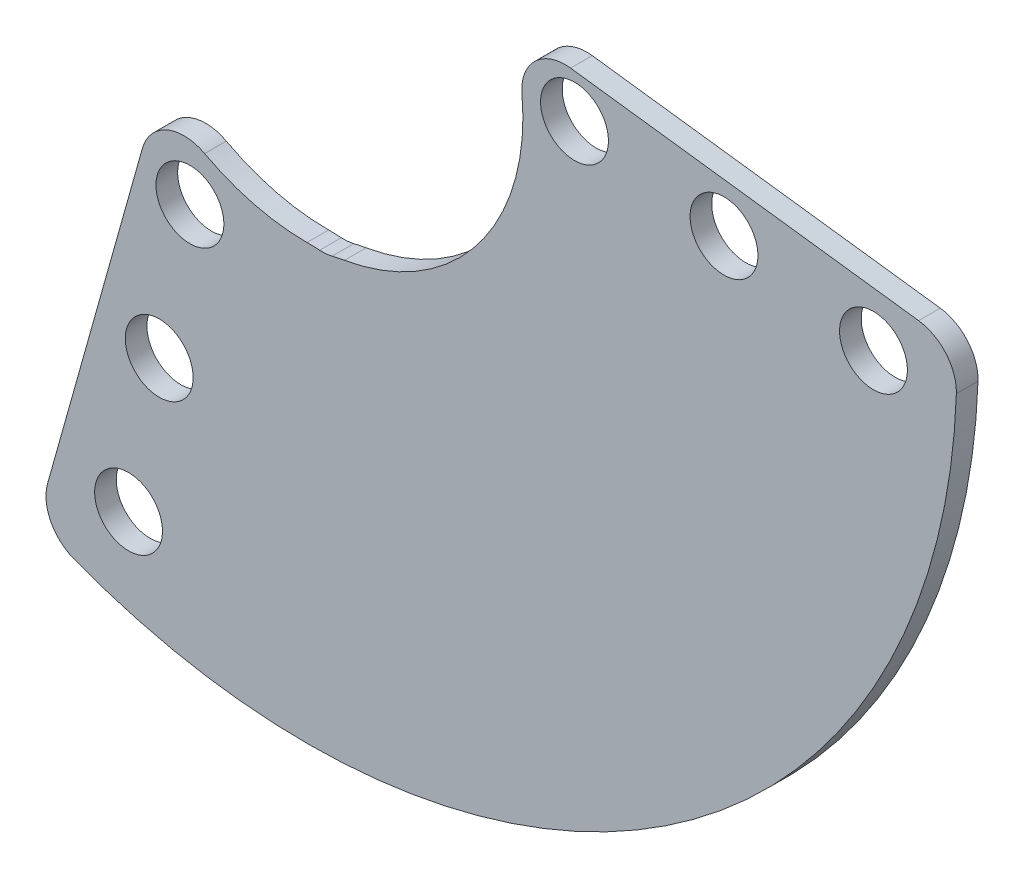
ISO-10303-21;
HEADER;
FILE_DESCRIPTION(('STEP AP214'),'2;1');
FILE_NAME('part.step','',(''),(''),'','','');
FILE_SCHEMA(('AUTOMOTIVE_DESIGN { 1 0 10303 214 1 1 1 1 }'));
ENDSEC;
DATA;
#1=APPLICATION_CONTEXT('core data for automotive mechanical design processes');
#2=APPLICATION_PROTOCOL_DEFINITION('international standard','automotive_design',2000,#1);
#3=PRODUCT_CONTEXT('',#1,'mechanical');
#4=PRODUCT('Part','Part','',(#3));
#5=PRODUCT_RELATED_PRODUCT_CATEGORY('part','',(#4));
#6=PRODUCT_DEFINITION_FORMATION('','',#4);
#7=PRODUCT_DEFINITION_CONTEXT('part definition',#1,'design');
#8=PRODUCT_DEFINITION('design','',#6,#7);
#9=PRODUCT_DEFINITION_SHAPE('','',#8);
#10=(LENGTH_UNIT() NAMED_UNIT(*) SI_UNIT(.MILLI.,.METRE.));
#11=(NAMED_UNIT(*) PLANE_ANGLE_UNIT() SI_UNIT($,.RADIAN.));
#12=(NAMED_UNIT(*) SI_UNIT($,.STERADIAN.) SOLID_ANGLE_UNIT());
#13=UNCERTAINTY_MEASURE_WITH_UNIT(LENGTH_MEASURE(1.E-05),#10,'distance_accuracy_value','');
#14=(GEOMETRIC_REPRESENTATION_CONTEXT(3) GLOBAL_UNCERTAINTY_ASSIGNED_CONTEXT((#13)) GLOBAL_UNIT_ASSIGNED_CONTEXT((#10,
#11,#12)) REPRESENTATION_CONTEXT('',''));
#15=CARTESIAN_POINT('',(0.,0.,0.));
#16=DIRECTION('',(0.,0.,1.));
#17=DIRECTION('',(1.,0.,0.));
#18=AXIS2_PLACEMENT_3D('',#15,#16,#17);
#19=CARTESIAN_POINT('',(385.445,238.4171,1.5875));
#20=DIRECTION('',(0.,0.,-1.));
#21=DIRECTION('',(-1.,0.,0.));
#22=AXIS2_PLACEMENT_3D('',#19,#20,#21);
#23=CYLINDRICAL_SURFACE('',#22,47.6614446089805);
#24=CARTESIAN_POINT('',(385.445,238.4171,1.5875));
#25=DIRECTION('',(0.,0.,1.));
#26=DIRECTION('',(1.,0.,0.));
#27=AXIS2_PLACEMENT_3D('',#24,#25,#26);
#28=CIRCLE('',#27,47.6614446089805);
#29=CARTESIAN_POINT('',(368.332755259209,193.933570664456,1.5875));
#30=VERTEX_POINT('',#29);
#31=CARTESIAN_POINT('',(433.078591350616,236.787904720903,1.5875));
#32=VERTEX_POINT('',#31);
#33=EDGE_CURVE('E171',#30,#32,#28,.T.);
#34=ORIENTED_EDGE('',*,*,#33,.F.);
#35=DIRECTION('',(0.,0.,-1.));
#36=VECTOR('',#35,1.);
#37=CARTESIAN_POINT('',(368.332755259209,193.933570664456,1.5875));
#38=LINE('',#37,#36);
#39=CARTESIAN_POINT('',(368.332755259209,193.933570664456,0.));
#40=VERTEX_POINT('',#39);
#41=EDGE_CURVE('E213',#30,#40,#38,.T.);
#42=ORIENTED_EDGE('',*,*,#41,.T.);
#43=CARTESIAN_POINT('',(385.445,238.4171,0.));
#44=DIRECTION('',(0.,0.,1.));
#45=DIRECTION('',(1.,0.,0.));
#46=AXIS2_PLACEMENT_3D('',#43,#44,#45);
#47=CIRCLE('',#46,47.6614446089805);
#48=CARTESIAN_POINT('',(433.078591350616,236.787904720903,0.));
#49=VERTEX_POINT('',#48);
#50=EDGE_CURVE('E183',#40,#49,#47,.T.);
#51=ORIENTED_EDGE('',*,*,#50,.T.);
#52=DIRECTION('',(0.,0.,-1.));
#53=VECTOR('',#52,1.);
#54=CARTESIAN_POINT('',(433.078591350616,236.787904720903,1.5875));
#55=LINE('',#54,#53);
#56=EDGE_CURVE('E151',#49,#32,#55,.F.);
#57=ORIENTED_EDGE('',*,*,#56,.T.);
#58=EDGE_LOOP('',(#34,#42,#51,#57));
#59=FACE_BOUND('',#58,.T.);
#60=ADVANCED_FACE('F47',(#59),#23,.T.);
#61=CARTESIAN_POINT('',(37.2977189243561,290.504239402004,1.5875));
#62=DIRECTION('',(0.127344311049222,0.991858571795092,0.));
#63=DIRECTION('',(-0.991858571795092,0.127344311049222,0.));
#64=AXIS2_PLACEMENT_3D('',#61,#62,#63);
#65=PLANE('',#64);
#66=DIRECTION('',(0.991858571795092,-0.127344311049222,0.));
#67=VECTOR('',#66,1.);
#68=CARTESIAN_POINT('',(37.2977189243561,290.504239402004,1.5875));
#69=LINE('',#68,#67);
#70=CARTESIAN_POINT('',(404.781529124907,243.323145279847,1.5875));
#71=VERTEX_POINT('',#70);
#72=CARTESIAN_POINT('',(430.309765002211,240.045585653364,1.5875));
#73=VERTEX_POINT('',#72);
#74=EDGE_CURVE('E167',#71,#73,#69,.T.);
#75=ORIENTED_EDGE('',*,*,#74,.T.);
#76=DIRECTION('',(0.,0.,1.));
#77=VECTOR('',#76,1.);
#78=CARTESIAN_POINT('',(430.309765002211,240.045585653364,0.));
#79=LINE('',#78,#77);
#80=CARTESIAN_POINT('',(430.309765002211,240.045585653364,0.));
#81=VERTEX_POINT('',#80);
#82=EDGE_CURVE('E258',#73,#81,#79,.F.);
#83=ORIENTED_EDGE('',*,*,#82,.T.);
#84=DIRECTION('',(0.991858571795092,-0.127344311049222,0.));
#85=VECTOR('',#84,1.);
#86=CARTESIAN_POINT('',(37.2977189243561,290.504239402004,0.));
#87=LINE('',#86,#85);
#88=CARTESIAN_POINT('',(404.781529124907,243.323145279847,0.));
#89=VERTEX_POINT('',#88);
#90=EDGE_CURVE('E187',#89,#81,#87,.T.);
#91=ORIENTED_EDGE('',*,*,#90,.F.);
#92=DIRECTION('',(0.,0.,-1.));
#93=VECTOR('',#92,1.);
#94=CARTESIAN_POINT('',(404.781529124907,243.323145279847,1.5875));
#95=LINE('',#94,#93);
#96=EDGE_CURVE('E255',#89,#71,#95,.F.);
#97=ORIENTED_EDGE('',*,*,#96,.T.);
#98=EDGE_LOOP('',(#75,#83,#91,#97));
#99=FACE_BOUND('',#98,.T.);
#100=ADVANCED_FACE('F367',(#99),#65,.T.);
#101=CARTESIAN_POINT('',(385.445,238.4171,1.5875));
#102=DIRECTION('',(0.,0.,-1.));
#103=DIRECTION('',(-1.,0.,0.));
#104=AXIS2_PLACEMENT_3D('',#101,#102,#103);
#105=CYLINDRICAL_SURFACE('',#104,15.8385553910197);
#106=CARTESIAN_POINT('',(385.445,238.4171,1.5875));
#107=DIRECTION('',(0.,0.,1.));
#108=DIRECTION('',(1.,0.,0.));
#109=AXIS2_PLACEMENT_3D('',#106,#107,#108);
#110=CIRCLE('',#109,15.8385553910197);
#111=CARTESIAN_POINT('',(388.195336280527,222.81916785441,1.5875));
#112=VERTEX_POINT('',#111);
#113=CARTESIAN_POINT('',(401.215794332707,239.880617335001,1.5875));
#114=VERTEX_POINT('',#113);
#115=EDGE_CURVE('E143',#112,#114,#110,.T.);
#116=ORIENTED_EDGE('',*,*,#115,.T.);
#117=DIRECTION('',(0.,0.,-1.));
#118=VECTOR('',#117,1.);
#119=CARTESIAN_POINT('',(401.215794332707,239.880617335001,1.5875));
#120=LINE('',#119,#118);
#121=CARTESIAN_POINT('',(401.215794332707,239.880617335001,0.));
#122=VERTEX_POINT('',#121);
#123=EDGE_CURVE('E262',#114,#122,#120,.T.);
#124=ORIENTED_EDGE('',*,*,#123,.T.);
#125=CARTESIAN_POINT('',(385.445,238.4171,0.));
#126=DIRECTION('',(0.,0.,1.));
#127=DIRECTION('',(1.,0.,0.));
#128=AXIS2_PLACEMENT_3D('',#125,#126,#127);
#129=CIRCLE('',#128,15.8385553910197);
#130=CARTESIAN_POINT('',(388.195336280527,222.81916785441,0.));
#131=VERTEX_POINT('',#130);
#132=EDGE_CURVE('E146',#131,#122,#129,.T.);
#133=ORIENTED_EDGE('',*,*,#132,.F.);
#134=DIRECTION('',(0.,0.,-1.));
#135=VECTOR('',#134,1.);
#136=CARTESIAN_POINT('',(388.195336280527,222.81916785441,1.5875));
#137=LINE('',#136,#135);
#138=EDGE_CURVE('E138',#112,#131,#137,.T.);
#139=ORIENTED_EDGE('',*,*,#138,.F.);
#140=EDGE_LOOP('',(#116,#124,#133,#139));
#141=FACE_BOUND('',#140,.T.);
#142=ADVANCED_FACE('F140',(#141),#105,.F.);
#143=CARTESIAN_POINT('',(390.958329640925,207.149453841862,1.5875));
#144=DIRECTION('',(0.,0.,-1.));
#145=DIRECTION('',(-1.,0.,0.));
#146=AXIS2_PLACEMENT_3D('',#143,#144,#145);
#147=CYLINDRICAL_SURFACE('',#146,15.9114446089804);
#148=CARTESIAN_POINT('',(390.958329640925,207.149453841862,0.));
#149=DIRECTION('',(0.,0.,1.));
#150=DIRECTION('',(1.,0.,0.));
#151=AXIS2_PLACEMENT_3D('',#148,#149,#150);
#152=CIRCLE('',#151,15.9114446089804);
#153=CARTESIAN_POINT('',(387.288110186018,222.631816668559,0.));
#154=VERTEX_POINT('',#153);
#155=EDGE_CURVE('E194',#131,#154,#152,.T.);
#156=ORIENTED_EDGE('',*,*,#155,.T.);
#157=DIRECTION('',(0.,0.,-1.));
#158=VECTOR('',#157,1.);
#159=CARTESIAN_POINT('',(387.288110186018,222.631816668559,1.5875));
#160=LINE('',#159,#158);
#161=CARTESIAN_POINT('',(387.288110186018,222.631816668559,1.5875));
#162=VERTEX_POINT('',#161);
#163=EDGE_CURVE('E157',#154,#162,#160,.F.);
#164=ORIENTED_EDGE('',*,*,#163,.T.);
#165=CARTESIAN_POINT('',(390.958329640925,207.149453841862,1.5875));
#166=DIRECTION('',(0.,0.,1.));
#167=DIRECTION('',(1.,0.,0.));
#168=AXIS2_PLACEMENT_3D('',#165,#166,#167);
#169=CIRCLE('',#168,15.9114446089804);
#170=EDGE_CURVE('E154',#112,#162,#169,.T.);
#171=ORIENTED_EDGE('',*,*,#170,.F.);
#172=ORIENTED_EDGE('',*,*,#138,.T.);
#173=EDGE_LOOP('',(#156,#164,#171,#172));
#174=FACE_BOUND('',#173,.T.);
#175=ADVANCED_FACE('F155',(#174),#147,.T.);
#176=CARTESIAN_POINT('',(385.445,206.6671,1.5875));
#177=DIRECTION('',(0.,0.,-1.));
#178=DIRECTION('',(-1.,0.,0.));
#179=AXIS2_PLACEMENT_3D('',#176,#177,#178);
#180=CYLINDRICAL_SURFACE('',#179,15.9114446089804);
#181=CARTESIAN_POINT('',(385.445,206.6671,1.5875));
#182=DIRECTION('',(0.,0.,1.));
#183=DIRECTION('',(1.,0.,0.));
#184=AXIS2_PLACEMENT_3D('',#181,#182,#183);
#185=CIRCLE('',#184,15.9114446089804);
#186=CARTESIAN_POINT('',(386.370976483615,222.551577866661,1.5875));
#187=VERTEX_POINT('',#186);
#188=CARTESIAN_POINT('',(385.445,222.57854460898,1.5875));
#189=VERTEX_POINT('',#188);
#190=EDGE_CURVE('E159',#187,#189,#185,.T.);
#191=ORIENTED_EDGE('',*,*,#190,.F.);
#192=DIRECTION('',(0.,0.,-1.));
#193=VECTOR('',#192,1.);
#194=CARTESIAN_POINT('',(386.370976483615,222.551577866661,1.5875));
#195=LINE('',#194,#193);
#196=CARTESIAN_POINT('',(386.370976483615,222.551577866661,0.));
#197=VERTEX_POINT('',#196);
#198=EDGE_CURVE('E249',#187,#197,#195,.T.);
#199=ORIENTED_EDGE('',*,*,#198,.T.);
#200=CARTESIAN_POINT('',(385.445,206.6671,0.));
#201=DIRECTION('',(0.,0.,1.));
#202=DIRECTION('',(1.,0.,0.));
#203=AXIS2_PLACEMENT_3D('',#200,#201,#202);
#204=CIRCLE('',#203,15.9114446089804);
#205=CARTESIAN_POINT('',(385.445,222.57854460898,0.));
#206=VERTEX_POINT('',#205);
#207=EDGE_CURVE('E197',#197,#206,#204,.T.);
#208=ORIENTED_EDGE('',*,*,#207,.T.);
#209=DIRECTION('',(0.,0.,-1.));
#210=VECTOR('',#209,1.);
#211=CARTESIAN_POINT('',(385.445,222.57854460898,1.5875));
#212=LINE('',#211,#210);
#213=EDGE_CURVE('E152',#189,#206,#212,.T.);
#214=ORIENTED_EDGE('',*,*,#213,.F.);
#215=EDGE_LOOP('',(#191,#199,#208,#214));
#216=FACE_BOUND('',#215,.T.);
#217=ADVANCED_FACE('F273',(#216),#180,.T.);
#218=CARTESIAN_POINT('',(385.445,238.4171,1.5875));
#219=DIRECTION('',(0.,0.,-1.));
#220=DIRECTION('',(-1.,0.,0.));
#221=AXIS2_PLACEMENT_3D('',#218,#219,#220);
#222=CYLINDRICAL_SURFACE('',#221,15.8385553910197);
#223=CARTESIAN_POINT('',(385.445,238.4171,0.));
#224=DIRECTION('',(0.,0.,1.));
#225=DIRECTION('',(1.,0.,0.));
#226=AXIS2_PLACEMENT_3D('',#223,#224,#225);
#227=CIRCLE('',#226,15.8385553910197);
#228=CARTESIAN_POINT('',(377.935684923229,224.471849053811,0.));
#229=VERTEX_POINT('',#228);
#230=EDGE_CURVE('E200',#229,#206,#227,.T.);
#231=ORIENTED_EDGE('',*,*,#230,.F.);
#232=DIRECTION('',(0.,0.,-1.));
#233=VECTOR('',#232,1.);
#234=CARTESIAN_POINT('',(377.935684923229,224.471849053811,1.5875));
#235=LINE('',#234,#233);
#236=CARTESIAN_POINT('',(377.935684923229,224.471849053811,1.5875));
#237=VERTEX_POINT('',#236);
#238=EDGE_CURVE('E63',#229,#237,#235,.F.);
#239=ORIENTED_EDGE('',*,*,#238,.T.);
#240=CARTESIAN_POINT('',(385.445,238.4171,1.5875));
#241=DIRECTION('',(0.,0.,1.));
#242=DIRECTION('',(1.,0.,0.));
#243=AXIS2_PLACEMENT_3D('',#240,#241,#242);
#244=CIRCLE('',#243,15.8385553910197);
#245=EDGE_CURVE('E177',#237,#189,#244,.T.);
#246=ORIENTED_EDGE('',*,*,#245,.T.);
#247=ORIENTED_EDGE('',*,*,#213,.T.);
#248=EDGE_LOOP('',(#231,#239,#246,#247));
#249=FACE_BOUND('',#248,.T.);
#250=ADVANCED_FACE('F486',(#249),#222,.F.);
#251=CARTESIAN_POINT('',(288.170495011221,-80.9133973352405,1.5875));
#252=DIRECTION('',(0.962768015638745,-0.270328962678867,0.));
#253=DIRECTION('',(0.270328962678867,0.962768015638746,0.));
#254=AXIS2_PLACEMENT_3D('',#251,#252,#253);
#255=PLANE('',#254);
#256=DIRECTION('',(-0.270328962678867,-0.962768015638746,0.));
#257=VECTOR('',#256,1.);
#258=CARTESIAN_POINT('',(288.170495011221,-80.9133973352405,0.));
#259=LINE('',#258,#257);
#260=CARTESIAN_POINT('',(373.373577662603,222.534675700212,0.));
#261=VERTEX_POINT('',#260);
#262=CARTESIAN_POINT('',(366.415910793582,197.755166103529,0.));
#263=VERTEX_POINT('',#262);
#264=EDGE_CURVE('E204',#261,#263,#259,.T.);
#265=ORIENTED_EDGE('',*,*,#264,.T.);
#266=DIRECTION('',(0.,0.,-1.));
#267=VECTOR('',#266,1.);
#268=CARTESIAN_POINT('',(366.415910793582,197.755166103529,1.5875));
#269=LINE('',#268,#267);
#270=CARTESIAN_POINT('',(366.415910793582,197.755166103529,1.5875));
#271=VERTEX_POINT('',#270);
#272=EDGE_CURVE('E233',#263,#271,#269,.F.);
#273=ORIENTED_EDGE('',*,*,#272,.T.);
#274=DIRECTION('',(-0.270328962678867,-0.962768015638746,0.));
#275=VECTOR('',#274,1.);
#276=CARTESIAN_POINT('',(288.170495011221,-80.9133973352405,1.5875));
#277=LINE('',#276,#275);
#278=CARTESIAN_POINT('',(373.373577662603,222.534675700212,1.5875));
#279=VERTEX_POINT('',#278);
#280=EDGE_CURVE('E180',#279,#271,#277,.T.);
#281=ORIENTED_EDGE('',*,*,#280,.F.);
#282=DIRECTION('',(0.,0.,1.));
#283=VECTOR('',#282,1.);
#284=CARTESIAN_POINT('',(373.373577662603,222.534675700212,0.));
#285=LINE('',#284,#283);
#286=EDGE_CURVE('E229',#279,#261,#285,.F.);
#287=ORIENTED_EDGE('',*,*,#286,.T.);
#288=EDGE_LOOP('',(#265,#273,#281,#287));
#289=FACE_BOUND('',#288,.T.);
#290=ADVANCED_FACE('F282',(#289),#255,.F.);
#291=CARTESIAN_POINT('',(0.,0.,1.5875));
#292=DIRECTION('',(0.,0.,1.));
#293=DIRECTION('',(1.,0.,0.));
#294=AXIS2_PLACEMENT_3D('',#291,#292,#293);
#295=PLANE('',#294);
#296=CARTESIAN_POINT('',(416.033470840365,238.286447947297,1.5875));
#297=DIRECTION('',(0.,0.,1.));
#298=DIRECTION('',(1.,0.,0.));
#299=AXIS2_PLACEMENT_3D('',#296,#297,#298);
#300=CIRCLE('',#299,2.48920000000001);
#301=CARTESIAN_POINT('',(418.522670840365,238.286447947297,1.5875));
#302=VERTEX_POINT('',#301);
#303=EDGE_CURVE('E299',#302,#302,#300,.T.);
#304=ORIENTED_EDGE('',*,*,#303,.F.);
#305=EDGE_LOOP('',(#304));
#306=FACE_BOUND('',#305,.T.);
#307=CARTESIAN_POINT('',(426.999398143164,236.487533096697,1.5875));
#308=DIRECTION('',(0.,0.,1.));
#309=DIRECTION('',(1.,0.,0.));
#310=AXIS2_PLACEMENT_3D('',#307,#308,#309);
#311=CIRCLE('',#310,2.48920000000001);
#312=CARTESIAN_POINT('',(429.488598143164,236.487533096697,1.5875));
#313=VERTEX_POINT('',#312);
#314=EDGE_CURVE('E324',#313,#313,#311,.T.);
#315=ORIENTED_EDGE('',*,*,#314,.F.);
#316=EDGE_LOOP('',(#315));
#317=FACE_BOUND('',#316,.T.);
#318=CARTESIAN_POINT('',(372.354631758057,198.931235532253,1.5875));
#319=DIRECTION('',(0.,0.,1.));
#320=DIRECTION('',(-1.,0.,0.));
#321=AXIS2_PLACEMENT_3D('',#318,#319,#320);
#322=CIRCLE('',#321,2.48920000000001);
#323=CARTESIAN_POINT('',(369.865431758057,198.931235532253,1.5875));
#324=VERTEX_POINT('',#323);
#325=EDGE_CURVE('E316',#324,#324,#322,.T.);
#326=ORIENTED_EDGE('',*,*,#325,.F.);
#327=EDGE_LOOP('',(#326));
#328=FACE_BOUND('',#327,.T.);
#329=CARTESIAN_POINT('',(374.605039614026,209.813483495417,1.5875));
#330=DIRECTION('',(0.,0.,1.));
#331=DIRECTION('',(-1.,0.,0.));
#332=AXIS2_PLACEMENT_3D('',#329,#330,#331);
#333=CIRCLE('',#332,2.48919999999995);
#334=CARTESIAN_POINT('',(372.115839614026,209.813483495417,1.5875));
#335=VERTEX_POINT('',#334);
#336=EDGE_CURVE('E307',#335,#335,#333,.T.);
#337=ORIENTED_EDGE('',*,*,#336,.F.);
#338=EDGE_LOOP('',(#337));
#339=FACE_BOUND('',#338,.T.);
#340=CARTESIAN_POINT('',(376.855447469996,220.695731458581,1.5875));
#341=DIRECTION('',(0.,0.,1.));
#342=DIRECTION('',(-1.,0.,0.));
#343=AXIS2_PLACEMENT_3D('',#340,#341,#342);
#344=CIRCLE('',#343,2.48920000000001);
#345=CARTESIAN_POINT('',(374.366247469996,220.695731458581,1.5875));
#346=VERTEX_POINT('',#345);
#347=EDGE_CURVE('E308',#346,#346,#344,.T.);
#348=ORIENTED_EDGE('',*,*,#347,.F.);
#349=EDGE_LOOP('',(#348));
#350=FACE_BOUND('',#349,.T.);
#351=CARTESIAN_POINT('',(405.067543537565,240.085362797898,1.5875));
#352=DIRECTION('',(0.,0.,1.));
#353=DIRECTION('',(1.,0.,0.));
#354=AXIS2_PLACEMENT_3D('',#351,#352,#353);
#355=CIRCLE('',#354,2.48920000000001);
#356=CARTESIAN_POINT('',(407.556743537565,240.085362797898,1.5875));
#357=VERTEX_POINT('',#356);
#358=EDGE_CURVE('E295',#357,#357,#355,.T.);
#359=ORIENTED_EDGE('',*,*,#358,.F.);
#360=EDGE_LOOP('',(#359));
#361=FACE_BOUND('',#360,.T.);
#362=ORIENTED_EDGE('',*,*,#280,.T.);
#363=CARTESIAN_POINT('',(369.472699243235,196.896871647023,1.5875));
#364=DIRECTION('',(0.,0.,1.));
#365=DIRECTION('',(1.,0.,0.));
#366=AXIS2_PLACEMENT_3D('',#363,#364,#365);
#367=CIRCLE('',#366,3.175);
#368=EDGE_CURVE('E244',#271,#30,#367,.T.);
#369=ORIENTED_EDGE('',*,*,#368,.T.);
#370=ORIENTED_EDGE('',*,*,#33,.T.);
#371=CARTESIAN_POINT('',(429.90544681463,236.896434687914,1.5875));
#372=DIRECTION('',(0.,0.,1.));
#373=DIRECTION('',(1.,0.,0.));
#374=AXIS2_PLACEMENT_3D('',#371,#372,#373);
#375=CIRCLE('',#374,3.175);
#376=EDGE_CURVE('E238',#32,#73,#375,.T.);
#377=ORIENTED_EDGE('',*,*,#376,.T.);
#378=ORIENTED_EDGE('',*,*,#74,.F.);
#379=CARTESIAN_POINT('',(404.377210937326,240.173994314398,1.5875));
#380=DIRECTION('',(0.,0.,1.));
#381=DIRECTION('',(1.,0.,0.));
#382=AXIS2_PLACEMENT_3D('',#379,#380,#381);
#383=CIRCLE('',#382,3.175);
#384=EDGE_CURVE('E165',#71,#114,#383,.T.);
#385=ORIENTED_EDGE('',*,*,#384,.T.);
#386=ORIENTED_EDGE('',*,*,#115,.F.);
#387=ORIENTED_EDGE('',*,*,#170,.T.);
#388=CARTESIAN_POINT('',(386.55574759697,225.721196871474,1.5875));
#389=DIRECTION('',(0.,0.,1.));
#390=DIRECTION('',(1.,0.,0.));
#391=AXIS2_PLACEMENT_3D('',#388,#389,#390);
#392=CIRCLE('',#391,3.175);
#393=EDGE_CURVE('E11',#162,#187,#392,.F.);
#394=ORIENTED_EDGE('',*,*,#393,.T.);
#395=ORIENTED_EDGE('',*,*,#190,.T.);
#396=ORIENTED_EDGE('',*,*,#245,.F.);
#397=CARTESIAN_POINT('',(376.430366112256,221.676381243707,1.5875));
#398=DIRECTION('',(0.,0.,1.));
#399=DIRECTION('',(1.,0.,0.));
#400=AXIS2_PLACEMENT_3D('',#397,#398,#399);
#401=CIRCLE('',#400,3.175);
#402=EDGE_CURVE('E241',#237,#279,#401,.T.);
#403=ORIENTED_EDGE('',*,*,#402,.T.);
#404=EDGE_LOOP('',(#362,#369,#370,#377,#378,#385,#386,#387,#394,#395,#396,#403));
#405=FACE_BOUND('',#404,.T.);
#406=ADVANCED_FACE('F162',(#306,#317,#328,#339,#350,#361,#405),#295,.T.);
#407=CARTESIAN_POINT('',(0.,0.,0.));
#408=DIRECTION('',(0.,0.,1.));
#409=DIRECTION('',(1.,0.,0.));
#410=AXIS2_PLACEMENT_3D('',#407,#408,#409);
#411=PLANE('',#410);
#412=CARTESIAN_POINT('',(416.033470840365,238.286447947297,0.));
#413=DIRECTION('',(0.,0.,1.));
#414=DIRECTION('',(1.,0.,0.));
#415=AXIS2_PLACEMENT_3D('',#412,#413,#414);
#416=CIRCLE('',#415,2.48920000000001);
#417=CARTESIAN_POINT('',(418.522670840365,238.286447947297,0.));
#418=VERTEX_POINT('',#417);
#419=EDGE_CURVE('E328',#418,#418,#416,.T.);
#420=ORIENTED_EDGE('',*,*,#419,.T.);
#421=EDGE_LOOP('',(#420));
#422=FACE_BOUND('',#421,.T.);
#423=CARTESIAN_POINT('',(426.999398143164,236.487533096697,0.));
#424=DIRECTION('',(0.,0.,1.));
#425=DIRECTION('',(1.,0.,0.));
#426=AXIS2_PLACEMENT_3D('',#423,#424,#425);
#427=CIRCLE('',#426,2.48920000000001);
#428=CARTESIAN_POINT('',(429.488598143164,236.487533096697,0.));
#429=VERTEX_POINT('',#428);
#430=EDGE_CURVE('E320',#429,#429,#427,.T.);
#431=ORIENTED_EDGE('',*,*,#430,.T.);
#432=EDGE_LOOP('',(#431));
#433=FACE_BOUND('',#432,.T.);
#434=CARTESIAN_POINT('',(372.354631758057,198.931235532253,0.));
#435=DIRECTION('',(0.,0.,1.));
#436=DIRECTION('',(-1.,0.,0.));
#437=AXIS2_PLACEMENT_3D('',#434,#435,#436);
#438=CIRCLE('',#437,2.48920000000001);
#439=CARTESIAN_POINT('',(369.865431758057,198.931235532253,0.));
#440=VERTEX_POINT('',#439);
#441=EDGE_CURVE('E312',#440,#440,#438,.T.);
#442=ORIENTED_EDGE('',*,*,#441,.T.);
#443=EDGE_LOOP('',(#442));
#444=FACE_BOUND('',#443,.T.);
#445=CARTESIAN_POINT('',(374.605039614026,209.813483495417,0.));
#446=DIRECTION('',(0.,0.,1.));
#447=DIRECTION('',(-1.,0.,0.));
#448=AXIS2_PLACEMENT_3D('',#445,#446,#447);
#449=CIRCLE('',#448,2.48919999999995);
#450=CARTESIAN_POINT('',(372.115839614026,209.813483495417,0.));
#451=VERTEX_POINT('',#450);
#452=EDGE_CURVE('E303',#451,#451,#449,.T.);
#453=ORIENTED_EDGE('',*,*,#452,.T.);
#454=EDGE_LOOP('',(#453));
#455=FACE_BOUND('',#454,.T.);
#456=CARTESIAN_POINT('',(376.855447469996,220.695731458581,0.));
#457=DIRECTION('',(0.,0.,1.));
#458=DIRECTION('',(-1.,0.,0.));
#459=AXIS2_PLACEMENT_3D('',#456,#457,#458);
#460=CIRCLE('',#459,2.48920000000001);
#461=CARTESIAN_POINT('',(374.366247469996,220.695731458581,0.));
#462=VERTEX_POINT('',#461);
#463=EDGE_CURVE('E335',#462,#462,#460,.T.);
#464=ORIENTED_EDGE('',*,*,#463,.T.);
#465=EDGE_LOOP('',(#464));
#466=FACE_BOUND('',#465,.T.);
#467=CARTESIAN_POINT('',(405.067543537565,240.085362797898,0.));
#468=DIRECTION('',(0.,0.,1.));
#469=DIRECTION('',(1.,0.,0.));
#470=AXIS2_PLACEMENT_3D('',#467,#468,#469);
#471=CIRCLE('',#470,2.48920000000001);
#472=CARTESIAN_POINT('',(407.556743537565,240.085362797898,0.));
#473=VERTEX_POINT('',#472);
#474=EDGE_CURVE('E188',#473,#473,#471,.T.);
#475=ORIENTED_EDGE('',*,*,#474,.T.);
#476=EDGE_LOOP('',(#475));
#477=FACE_BOUND('',#476,.T.);
#478=ORIENTED_EDGE('',*,*,#50,.F.);
#479=CARTESIAN_POINT('',(369.472699243235,196.896871647023,0.));
#480=DIRECTION('',(0.,0.,1.));
#481=DIRECTION('',(1.,0.,0.));
#482=AXIS2_PLACEMENT_3D('',#479,#480,#481);
#483=CIRCLE('',#482,3.175);
#484=EDGE_CURVE('E226',#40,#263,#483,.F.);
#485=ORIENTED_EDGE('',*,*,#484,.T.);
#486=ORIENTED_EDGE('',*,*,#264,.F.);
#487=CARTESIAN_POINT('',(376.430366112256,221.676381243707,0.));
#488=DIRECTION('',(0.,0.,1.));
#489=DIRECTION('',(1.,0.,0.));
#490=AXIS2_PLACEMENT_3D('',#487,#488,#489);
#491=CIRCLE('',#490,3.175);
#492=EDGE_CURVE('E223',#261,#229,#491,.F.);
#493=ORIENTED_EDGE('',*,*,#492,.T.);
#494=ORIENTED_EDGE('',*,*,#230,.T.);
#495=ORIENTED_EDGE('',*,*,#207,.F.);
#496=CARTESIAN_POINT('',(386.55574759697,225.721196871474,0.));
#497=DIRECTION('',(0.,0.,1.));
#498=DIRECTION('',(1.,0.,0.));
#499=AXIS2_PLACEMENT_3D('',#496,#497,#498);
#500=CIRCLE('',#499,3.175);
#501=EDGE_CURVE('E56',#197,#154,#500,.T.);
#502=ORIENTED_EDGE('',*,*,#501,.T.);
#503=ORIENTED_EDGE('',*,*,#155,.F.);
#504=ORIENTED_EDGE('',*,*,#132,.T.);
#505=CARTESIAN_POINT('',(404.377210937326,240.173994314398,0.));
#506=DIRECTION('',(0.,0.,1.));
#507=DIRECTION('',(1.,0.,0.));
#508=AXIS2_PLACEMENT_3D('',#505,#506,#507);
#509=CIRCLE('',#508,3.175);
#510=EDGE_CURVE('E217',#122,#89,#509,.F.);
#511=ORIENTED_EDGE('',*,*,#510,.T.);
#512=ORIENTED_EDGE('',*,*,#90,.T.);
#513=CARTESIAN_POINT('',(429.90544681463,236.896434687914,0.));
#514=DIRECTION('',(0.,0.,1.));
#515=DIRECTION('',(1.,0.,0.));
#516=AXIS2_PLACEMENT_3D('',#513,#514,#515);
#517=CIRCLE('',#516,3.175);
#518=EDGE_CURVE('E220',#81,#49,#517,.F.);
#519=ORIENTED_EDGE('',*,*,#518,.T.);
#520=EDGE_LOOP('',(#478,#485,#486,#493,#494,#495,#502,#503,#504,#511,#512,#519));
#521=FACE_BOUND('',#520,.T.);
#522=ADVANCED_FACE('F268',(#422,#433,#444,#455,#466,#477,#521),#411,.F.);
#523=CARTESIAN_POINT('',(405.067543537565,240.085362797898,0.));
#524=DIRECTION('',(0.,0.,1.));
#525=DIRECTION('',(1.,0.,0.));
#526=AXIS2_PLACEMENT_3D('',#523,#524,#525);
#527=CYLINDRICAL_SURFACE('',#526,2.48920000000001);
#528=ORIENTED_EDGE('',*,*,#474,.F.);
#529=EDGE_LOOP('',(#528));
#530=FACE_BOUND('',#529,.T.);
#531=ORIENTED_EDGE('',*,*,#358,.T.);
#532=EDGE_LOOP('',(#531));
#533=FACE_BOUND('',#532,.T.);
#534=ADVANCED_FACE('F351',(#530,#533),#527,.F.);
#535=CARTESIAN_POINT('',(376.855447469996,220.695731458581,0.));
#536=DIRECTION('',(0.,0.,1.));
#537=DIRECTION('',(1.,0.,0.));
#538=AXIS2_PLACEMENT_3D('',#535,#536,#537);
#539=CYLINDRICAL_SURFACE('',#538,2.48920000000001);
#540=ORIENTED_EDGE('',*,*,#463,.F.);
#541=EDGE_LOOP('',(#540));
#542=FACE_BOUND('',#541,.T.);
#543=ORIENTED_EDGE('',*,*,#347,.T.);
#544=EDGE_LOOP('',(#543));
#545=FACE_BOUND('',#544,.T.);
#546=ADVANCED_FACE('F343',(#542,#545),#539,.F.);
#547=CARTESIAN_POINT('',(374.605039614026,209.813483495417,0.));
#548=DIRECTION('',(0.,0.,1.));
#549=DIRECTION('',(1.,0.,0.));
#550=AXIS2_PLACEMENT_3D('',#547,#548,#549);
#551=CYLINDRICAL_SURFACE('',#550,2.48919999999995);
#552=ORIENTED_EDGE('',*,*,#452,.F.);
#553=EDGE_LOOP('',(#552));
#554=FACE_BOUND('',#553,.T.);
#555=ORIENTED_EDGE('',*,*,#336,.T.);
#556=EDGE_LOOP('',(#555));
#557=FACE_BOUND('',#556,.T.);
#558=ADVANCED_FACE('F358',(#554,#557),#551,.F.);
#559=CARTESIAN_POINT('',(372.354631758057,198.931235532253,0.));
#560=DIRECTION('',(0.,0.,1.));
#561=DIRECTION('',(1.,0.,0.));
#562=AXIS2_PLACEMENT_3D('',#559,#560,#561);
#563=CYLINDRICAL_SURFACE('',#562,2.48920000000001);
#564=ORIENTED_EDGE('',*,*,#441,.F.);
#565=EDGE_LOOP('',(#564));
#566=FACE_BOUND('',#565,.T.);
#567=ORIENTED_EDGE('',*,*,#325,.T.);
#568=EDGE_LOOP('',(#567));
#569=FACE_BOUND('',#568,.T.);
#570=ADVANCED_FACE('F436',(#566,#569),#563,.F.);
#571=CARTESIAN_POINT('',(426.999398143164,236.487533096697,0.));
#572=DIRECTION('',(0.,0.,1.));
#573=DIRECTION('',(1.,0.,0.));
#574=AXIS2_PLACEMENT_3D('',#571,#572,#573);
#575=CYLINDRICAL_SURFACE('',#574,2.48920000000001);
#576=ORIENTED_EDGE('',*,*,#430,.F.);
#577=EDGE_LOOP('',(#576));
#578=FACE_BOUND('',#577,.T.);
#579=ORIENTED_EDGE('',*,*,#314,.T.);
#580=EDGE_LOOP('',(#579));
#581=FACE_BOUND('',#580,.T.);
#582=ADVANCED_FACE('F426',(#578,#581),#575,.F.);
#583=CARTESIAN_POINT('',(416.033470840365,238.286447947297,0.));
#584=DIRECTION('',(0.,0.,1.));
#585=DIRECTION('',(1.,0.,0.));
#586=AXIS2_PLACEMENT_3D('',#583,#584,#585);
#587=CYLINDRICAL_SURFACE('',#586,2.48920000000001);
#588=ORIENTED_EDGE('',*,*,#419,.F.);
#589=EDGE_LOOP('',(#588));
#590=FACE_BOUND('',#589,.T.);
#591=ORIENTED_EDGE('',*,*,#303,.T.);
#592=EDGE_LOOP('',(#591));
#593=FACE_BOUND('',#592,.T.);
#594=ADVANCED_FACE('F379',(#590,#593),#587,.F.);
#595=CARTESIAN_POINT('',(369.472699243235,196.896871647023,1.5875));
#596=DIRECTION('',(0.,0.,-1.));
#597=DIRECTION('',(-1.,0.,0.));
#598=AXIS2_PLACEMENT_3D('',#595,#596,#597);
#599=CYLINDRICAL_SURFACE('',#598,3.175);
#600=ORIENTED_EDGE('',*,*,#368,.F.);
#601=ORIENTED_EDGE('',*,*,#272,.F.);
#602=ORIENTED_EDGE('',*,*,#484,.F.);
#603=ORIENTED_EDGE('',*,*,#41,.F.);
#604=EDGE_LOOP('',(#600,#601,#602,#603));
#605=FACE_BOUND('',#604,.T.);
#606=ADVANCED_FACE('F287',(#605),#599,.T.);
#607=CARTESIAN_POINT('',(376.430366112256,221.676381243707,1.5875));
#608=DIRECTION('',(0.,0.,-1.));
#609=DIRECTION('',(-1.,0.,0.));
#610=AXIS2_PLACEMENT_3D('',#607,#608,#609);
#611=CYLINDRICAL_SURFACE('',#610,3.175);
#612=ORIENTED_EDGE('',*,*,#402,.F.);
#613=ORIENTED_EDGE('',*,*,#238,.F.);
#614=ORIENTED_EDGE('',*,*,#492,.F.);
#615=ORIENTED_EDGE('',*,*,#286,.F.);
#616=EDGE_LOOP('',(#612,#613,#614,#615));
#617=FACE_BOUND('',#616,.T.);
#618=ADVANCED_FACE('F279',(#617),#611,.T.);
#619=CARTESIAN_POINT('',(386.55574759697,225.721196871474,1.5875));
#620=DIRECTION('',(0.,0.,1.));
#621=DIRECTION('',(1.,0.,0.));
#622=AXIS2_PLACEMENT_3D('',#619,#620,#621);
#623=CYLINDRICAL_SURFACE('',#622,3.175);
#624=ORIENTED_EDGE('',*,*,#393,.F.);
#625=ORIENTED_EDGE('',*,*,#163,.F.);
#626=ORIENTED_EDGE('',*,*,#501,.F.);
#627=ORIENTED_EDGE('',*,*,#198,.F.);
#628=EDGE_LOOP('',(#624,#625,#626,#627));
#629=FACE_BOUND('',#628,.T.);
#630=ADVANCED_FACE('F271',(#629),#623,.F.);
#631=CARTESIAN_POINT('',(429.90544681463,236.896434687914,1.5875));
#632=DIRECTION('',(0.,0.,-1.));
#633=DIRECTION('',(-1.,0.,0.));
#634=AXIS2_PLACEMENT_3D('',#631,#632,#633);
#635=CYLINDRICAL_SURFACE('',#634,3.175);
#636=ORIENTED_EDGE('',*,*,#376,.F.);
#637=ORIENTED_EDGE('',*,*,#56,.F.);
#638=ORIENTED_EDGE('',*,*,#518,.F.);
#639=ORIENTED_EDGE('',*,*,#82,.F.);
#640=EDGE_LOOP('',(#636,#637,#638,#639));
#641=FACE_BOUND('',#640,.T.);
#642=ADVANCED_FACE('F383',(#641),#635,.T.);
#643=CARTESIAN_POINT('',(404.377210937326,240.173994314398,1.5875));
#644=DIRECTION('',(0.,0.,-1.));
#645=DIRECTION('',(-1.,0.,0.));
#646=AXIS2_PLACEMENT_3D('',#643,#644,#645);
#647=CYLINDRICAL_SURFACE('',#646,3.175);
#648=ORIENTED_EDGE('',*,*,#384,.F.);
#649=ORIENTED_EDGE('',*,*,#96,.F.);
#650=ORIENTED_EDGE('',*,*,#510,.F.);
#651=ORIENTED_EDGE('',*,*,#123,.F.);
#652=EDGE_LOOP('',(#648,#649,#650,#651));
#653=FACE_BOUND('',#652,.T.);
#654=ADVANCED_FACE('F49',(#653),#647,.T.);
#655=CLOSED_SHELL('',(#60,#100,#142,#175,#217,#250,#290,#406,#522,#534,#546,#558,#570,#582,#594,
#606,#618,#630,#642,#654));
#656=MANIFOLD_SOLID_BREP('B2',#655);
#657=ADVANCED_BREP_SHAPE_REPRESENTATION('',(#18,#656),#14);
#658=SHAPE_DEFINITION_REPRESENTATION(#9,#657);
ENDSEC;
END-ISO-10303-21;
